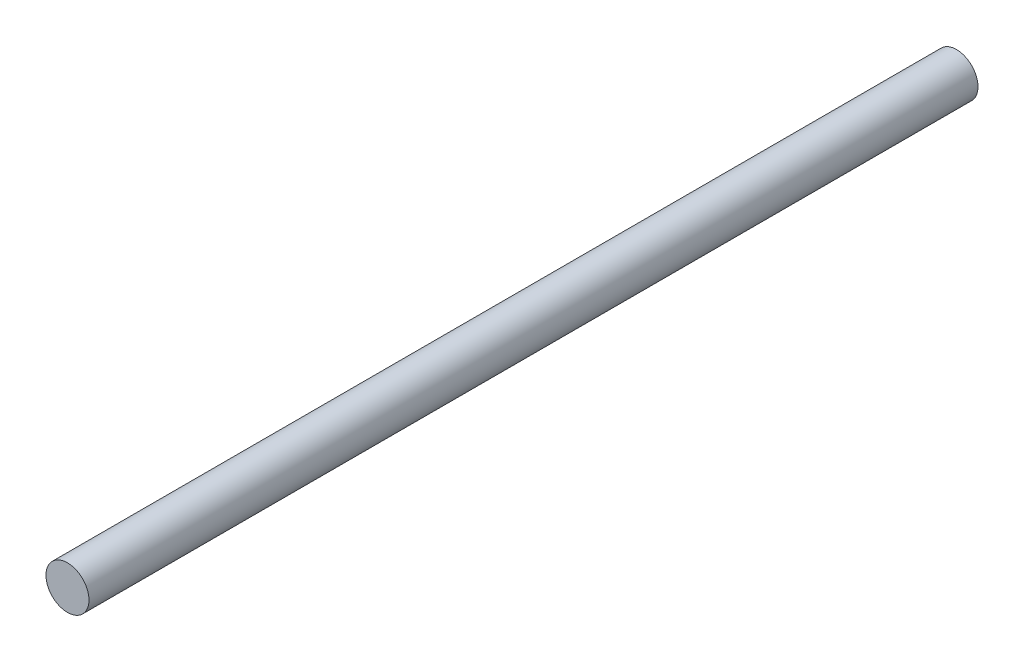
ISO-10303-21;
HEADER;
FILE_DESCRIPTION(('STEP AP214'),'2;1');
FILE_NAME('part.step','',(''),(''),'','','');
FILE_SCHEMA(('AUTOMOTIVE_DESIGN { 1 0 10303 214 1 1 1 1 }'));
ENDSEC;
DATA;
#1=APPLICATION_CONTEXT('core data for automotive mechanical design processes');
#2=APPLICATION_PROTOCOL_DEFINITION('international standard','automotive_design',2000,#1);
#3=PRODUCT_CONTEXT('',#1,'mechanical');
#4=PRODUCT('Part','Part','',(#3));
#5=PRODUCT_RELATED_PRODUCT_CATEGORY('part','',(#4));
#6=PRODUCT_DEFINITION_FORMATION('','',#4);
#7=PRODUCT_DEFINITION_CONTEXT('part definition',#1,'design');
#8=PRODUCT_DEFINITION('design','',#6,#7);
#9=PRODUCT_DEFINITION_SHAPE('','',#8);
#10=(LENGTH_UNIT() NAMED_UNIT(*) SI_UNIT(.MILLI.,.METRE.));
#11=(NAMED_UNIT(*) PLANE_ANGLE_UNIT() SI_UNIT($,.RADIAN.));
#12=(NAMED_UNIT(*) SI_UNIT($,.STERADIAN.) SOLID_ANGLE_UNIT());
#13=UNCERTAINTY_MEASURE_WITH_UNIT(LENGTH_MEASURE(1.E-05),#10,'distance_accuracy_value','');
#14=(GEOMETRIC_REPRESENTATION_CONTEXT(3) GLOBAL_UNCERTAINTY_ASSIGNED_CONTEXT((#13)) GLOBAL_UNIT_ASSIGNED_CONTEXT((#10,
#11,#12)) REPRESENTATION_CONTEXT('',''));
#15=CARTESIAN_POINT('',(0.,0.,0.));
#16=DIRECTION('',(0.,0.,1.));
#17=DIRECTION('',(1.,0.,0.));
#18=AXIS2_PLACEMENT_3D('',#15,#16,#17);
#19=CARTESIAN_POINT('',(0.,0.,62.));
#20=DIRECTION('',(0.,0.,-1.));
#21=DIRECTION('',(-1.,0.,0.));
#22=AXIS2_PLACEMENT_3D('',#19,#20,#21);
#23=CYLINDRICAL_SURFACE('',#22,1.5);
#24=CARTESIAN_POINT('',(0.,0.,62.));
#25=DIRECTION('',(0.,0.,1.));
#26=DIRECTION('',(1.,0.,0.));
#27=AXIS2_PLACEMENT_3D('',#24,#25,#26);
#28=CIRCLE('',#27,1.5);
#29=CARTESIAN_POINT('',(1.5,0.,62.));
#30=VERTEX_POINT('',#29);
#31=EDGE_CURVE('E10',#30,#30,#28,.T.);
#32=ORIENTED_EDGE('',*,*,#31,.F.);
#33=EDGE_LOOP('',(#32));
#34=FACE_BOUND('',#33,.T.);
#35=CARTESIAN_POINT('',(0.,0.,0.));
#36=DIRECTION('',(0.,0.,1.));
#37=DIRECTION('',(1.,0.,0.));
#38=AXIS2_PLACEMENT_3D('',#35,#36,#37);
#39=CIRCLE('',#38,1.5);
#40=CARTESIAN_POINT('',(1.5,0.,0.));
#41=VERTEX_POINT('',#40);
#42=EDGE_CURVE('E34',#41,#41,#39,.T.);
#43=ORIENTED_EDGE('',*,*,#42,.T.);
#44=EDGE_LOOP('',(#43));
#45=FACE_BOUND('',#44,.T.);
#46=ADVANCED_FACE('F31',(#34,#45),#23,.T.);
#47=CARTESIAN_POINT('',(0.,0.,62.));
#48=DIRECTION('',(0.,0.,1.));
#49=DIRECTION('',(1.,0.,0.));
#50=AXIS2_PLACEMENT_3D('',#47,#48,#49);
#51=PLANE('',#50);
#52=ORIENTED_EDGE('',*,*,#31,.T.);
#53=EDGE_LOOP('',(#52));
#54=FACE_BOUND('',#53,.T.);
#55=ADVANCED_FACE('F46',(#54),#51,.T.);
#56=CARTESIAN_POINT('',(0.,0.,0.));
#57=DIRECTION('',(0.,0.,1.));
#58=DIRECTION('',(1.,0.,0.));
#59=AXIS2_PLACEMENT_3D('',#56,#57,#58);
#60=PLANE('',#59);
#61=ORIENTED_EDGE('',*,*,#42,.F.);
#62=EDGE_LOOP('',(#61));
#63=FACE_BOUND('',#62,.T.);
#64=ADVANCED_FACE('F44',(#63),#60,.F.);
#65=CLOSED_SHELL('',(#46,#55,#64));
#66=MANIFOLD_SOLID_BREP('B2',#65);
#67=ADVANCED_BREP_SHAPE_REPRESENTATION('',(#18,#66),#14);
#68=SHAPE_DEFINITION_REPRESENTATION(#9,#67);
ENDSEC;
END-ISO-10303-21;
